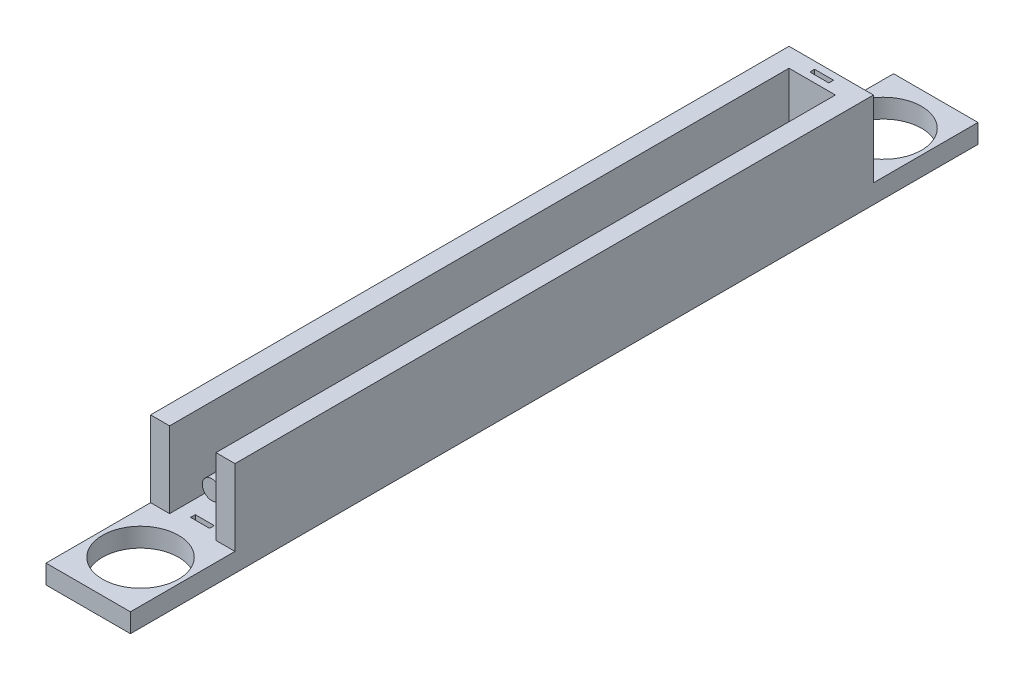
ISO-10303-21;
HEADER;
FILE_DESCRIPTION(('STEP AP214'),'2;1');
FILE_NAME('part.step','',(''),(''),'','','');
FILE_SCHEMA(('AUTOMOTIVE_DESIGN { 1 0 10303 214 1 1 1 1 }'));
ENDSEC;
DATA;
#1=APPLICATION_CONTEXT('core data for automotive mechanical design processes');
#2=APPLICATION_PROTOCOL_DEFINITION('international standard','automotive_design',2000,#1);
#3=PRODUCT_CONTEXT('',#1,'mechanical');
#4=PRODUCT('Part','Part','',(#3));
#5=PRODUCT_RELATED_PRODUCT_CATEGORY('part','',(#4));
#6=PRODUCT_DEFINITION_FORMATION('','',#4);
#7=PRODUCT_DEFINITION_CONTEXT('part definition',#1,'design');
#8=PRODUCT_DEFINITION('design','',#6,#7);
#9=PRODUCT_DEFINITION_SHAPE('','',#8);
#10=(LENGTH_UNIT() NAMED_UNIT(*) SI_UNIT(.MILLI.,.METRE.));
#11=(NAMED_UNIT(*) PLANE_ANGLE_UNIT() SI_UNIT($,.RADIAN.));
#12=(NAMED_UNIT(*) SI_UNIT($,.STERADIAN.) SOLID_ANGLE_UNIT());
#13=UNCERTAINTY_MEASURE_WITH_UNIT(LENGTH_MEASURE(1.E-05),#10,'distance_accuracy_value','');
#14=(GEOMETRIC_REPRESENTATION_CONTEXT(3) GLOBAL_UNCERTAINTY_ASSIGNED_CONTEXT((#13)) GLOBAL_UNIT_ASSIGNED_CONTEXT((#10,
#11,#12)) REPRESENTATION_CONTEXT('',''));
#15=CARTESIAN_POINT('',(0.,0.,0.));
#16=DIRECTION('',(0.,0.,1.));
#17=DIRECTION('',(1.,0.,0.));
#18=AXIS2_PLACEMENT_3D('',#15,#16,#17);
#19=CARTESIAN_POINT('',(-2.22,1.,-16.79));
#20=DIRECTION('',(0.,0.,1.));
#21=DIRECTION('',(1.,0.,0.));
#22=AXIS2_PLACEMENT_3D('',#19,#20,#21);
#23=PLANE('',#22);
#24=DIRECTION('',(1.,0.,0.));
#25=VECTOR('',#24,1.);
#26=CARTESIAN_POINT('',(2.22,1.,-16.79));
#27=LINE('',#26,#25);
#28=CARTESIAN_POINT('',(-2.22,1.,-16.79));
#29=VERTEX_POINT('',#28);
#30=CARTESIAN_POINT('',(2.22,1.,-16.79));
#31=VERTEX_POINT('',#30);
#32=EDGE_CURVE('E50',#29,#31,#27,.T.);
#33=ORIENTED_EDGE('',*,*,#32,.F.);
#34=DIRECTION('',(0.,-1.,0.));
#35=VECTOR('',#34,1.);
#36=CARTESIAN_POINT('',(-2.22,1.,-16.79));
#37=LINE('',#36,#35);
#38=CARTESIAN_POINT('',(-2.22,5.,-16.79));
#39=VERTEX_POINT('',#38);
#40=EDGE_CURVE('E325',#39,#29,#37,.T.);
#41=ORIENTED_EDGE('',*,*,#40,.F.);
#42=DIRECTION('',(-1.,0.,0.));
#43=VECTOR('',#42,1.);
#44=CARTESIAN_POINT('',(-2.22,5.,-16.79));
#45=LINE('',#44,#43);
#46=CARTESIAN_POINT('',(2.22,5.,-16.79));
#47=VERTEX_POINT('',#46);
#48=EDGE_CURVE('E283',#47,#39,#45,.T.);
#49=ORIENTED_EDGE('',*,*,#48,.F.);
#50=DIRECTION('',(0.,-1.,0.));
#51=VECTOR('',#50,1.);
#52=CARTESIAN_POINT('',(2.22,1.,-16.79));
#53=LINE('',#52,#51);
#54=EDGE_CURVE('E327',#47,#31,#53,.T.);
#55=ORIENTED_EDGE('',*,*,#54,.T.);
#56=EDGE_LOOP('',(#33,#41,#49,#55));
#57=FACE_BOUND('',#56,.T.);
#58=ADVANCED_FACE('F32',(#57),#23,.F.);
#59=CARTESIAN_POINT('',(-2.22,1.,16.79));
#60=DIRECTION('',(0.,0.,-1.));
#61=DIRECTION('',(-1.,0.,0.));
#62=AXIS2_PLACEMENT_3D('',#59,#60,#61);
#63=PLANE('',#62);
#64=DIRECTION('',(-1.,0.,0.));
#65=VECTOR('',#64,1.);
#66=CARTESIAN_POINT('',(2.22,1.,16.79));
#67=LINE('',#66,#65);
#68=CARTESIAN_POINT('',(2.22,1.,16.79));
#69=VERTEX_POINT('',#68);
#70=CARTESIAN_POINT('',(1.22,1.,16.79));
#71=VERTEX_POINT('',#70);
#72=EDGE_CURVE('E43',#69,#71,#67,.T.);
#73=ORIENTED_EDGE('',*,*,#72,.F.);
#74=DIRECTION('',(0.,-1.,0.));
#75=VECTOR('',#74,1.);
#76=CARTESIAN_POINT('',(2.22,1.,16.79));
#77=LINE('',#76,#75);
#78=CARTESIAN_POINT('',(2.22,5.,16.79));
#79=VERTEX_POINT('',#78);
#80=EDGE_CURVE('E321',#79,#69,#77,.T.);
#81=ORIENTED_EDGE('',*,*,#80,.F.);
#82=DIRECTION('',(1.,0.,0.));
#83=VECTOR('',#82,1.);
#84=CARTESIAN_POINT('',(2.22,5.,16.79));
#85=LINE('',#84,#83);
#86=CARTESIAN_POINT('',(1.22,5.,16.79));
#87=VERTEX_POINT('',#86);
#88=EDGE_CURVE('E298',#87,#79,#85,.T.);
#89=ORIENTED_EDGE('',*,*,#88,.F.);
#90=DIRECTION('',(0.,-1.,0.));
#91=VECTOR('',#90,1.);
#92=CARTESIAN_POINT('',(1.22,5.,16.79));
#93=LINE('',#92,#91);
#94=EDGE_CURVE('E304',#87,#71,#93,.T.);
#95=ORIENTED_EDGE('',*,*,#94,.T.);
#96=EDGE_LOOP('',(#73,#81,#89,#95));
#97=FACE_BOUND('',#96,.T.);
#98=ADVANCED_FACE('F374',(#97),#63,.F.);
#99=CARTESIAN_POINT('',(-1.22,1.,16.79));
#100=VERTEX_POINT('',#99);
#101=CARTESIAN_POINT('',(-2.22,1.,16.79));
#102=VERTEX_POINT('',#101);
#103=EDGE_CURVE('E11',#100,#102,#67,.T.);
#104=ORIENTED_EDGE('',*,*,#103,.F.);
#105=DIRECTION('',(0.,-1.,0.));
#106=VECTOR('',#105,1.);
#107=CARTESIAN_POINT('',(-1.22,5.,16.79));
#108=LINE('',#107,#106);
#109=CARTESIAN_POINT('',(-1.22,5.,16.79));
#110=VERTEX_POINT('',#109);
#111=EDGE_CURVE('E184',#110,#100,#108,.T.);
#112=ORIENTED_EDGE('',*,*,#111,.F.);
#113=DIRECTION('',(1.,0.,0.));
#114=VECTOR('',#113,1.);
#115=CARTESIAN_POINT('',(-2.22,5.,16.79));
#116=LINE('',#115,#114);
#117=CARTESIAN_POINT('',(-2.22,5.,16.79));
#118=VERTEX_POINT('',#117);
#119=EDGE_CURVE('E290',#118,#110,#116,.T.);
#120=ORIENTED_EDGE('',*,*,#119,.F.);
#121=DIRECTION('',(0.,-1.,0.));
#122=VECTOR('',#121,1.);
#123=CARTESIAN_POINT('',(-2.22,1.,16.79));
#124=LINE('',#123,#122);
#125=EDGE_CURVE('E323',#118,#102,#124,.T.);
#126=ORIENTED_EDGE('',*,*,#125,.T.);
#127=EDGE_LOOP('',(#104,#112,#120,#126));
#128=FACE_BOUND('',#127,.T.);
#129=ADVANCED_FACE('F378',(#128),#63,.F.);
#130=CARTESIAN_POINT('',(0.,1.,0.));
#131=DIRECTION('',(0.,-1.,0.));
#132=DIRECTION('',(0.,0.,-1.));
#133=AXIS2_PLACEMENT_3D('',#130,#131,#132);
#134=PLANE('',#133);
#135=CARTESIAN_POINT('',(0.,1.,19.5391712456763));
#136=DIRECTION('',(0.,1.,0.));
#137=DIRECTION('',(0.,0.,1.));
#138=AXIS2_PLACEMENT_3D('',#135,#136,#137);
#139=CIRCLE('',#138,2.);
#140=CARTESIAN_POINT('',(0.,1.,21.5391712456763));
#141=VERTEX_POINT('',#140);
#142=EDGE_CURVE('E210',#141,#141,#139,.T.);
#143=ORIENTED_EDGE('',*,*,#142,.F.);
#144=EDGE_LOOP('',(#143));
#145=FACE_BOUND('',#144,.T.);
#146=DIRECTION('',(-1.,0.,0.));
#147=VECTOR('',#146,1.);
#148=CARTESIAN_POINT('',(-0.500000000000003,1.,16.1585290962801));
#149=LINE('',#148,#147);
#150=CARTESIAN_POINT('',(0.499999999999998,1.,16.1585290962801));
#151=VERTEX_POINT('',#150);
#152=CARTESIAN_POINT('',(-0.500000000000003,1.,16.1585290962801));
#153=VERTEX_POINT('',#152);
#154=EDGE_CURVE('E261',#151,#153,#149,.T.);
#155=ORIENTED_EDGE('',*,*,#154,.F.);
#156=DIRECTION('',(0.,0.,-1.));
#157=VECTOR('',#156,1.);
#158=CARTESIAN_POINT('',(0.499999999999998,1.,16.1585290962801));
#159=LINE('',#158,#157);
#160=CARTESIAN_POINT('',(0.499999999999998,1.,16.4085290962801));
#161=VERTEX_POINT('',#160);
#162=EDGE_CURVE('E253',#161,#151,#159,.T.);
#163=ORIENTED_EDGE('',*,*,#162,.F.);
#164=DIRECTION('',(1.,0.,0.));
#165=VECTOR('',#164,1.);
#166=CARTESIAN_POINT('',(-0.500000000000003,1.,16.4085290962801));
#167=LINE('',#166,#165);
#168=CARTESIAN_POINT('',(-0.500000000000003,1.,16.4085290962801));
#169=VERTEX_POINT('',#168);
#170=EDGE_CURVE('E267',#169,#161,#167,.T.);
#171=ORIENTED_EDGE('',*,*,#170,.F.);
#172=DIRECTION('',(0.,0.,1.));
#173=VECTOR('',#172,1.);
#174=CARTESIAN_POINT('',(-0.500000000000003,1.,16.1585290962801));
#175=LINE('',#174,#173);
#176=EDGE_CURVE('E264',#153,#169,#175,.T.);
#177=ORIENTED_EDGE('',*,*,#176,.F.);
#178=EDGE_LOOP('',(#155,#163,#171,#177));
#179=FACE_BOUND('',#178,.T.);
#180=DIRECTION('',(0.,0.,1.));
#181=VECTOR('',#180,1.);
#182=CARTESIAN_POINT('',(1.22,1.,16.79));
#183=LINE('',#182,#181);
#184=CARTESIAN_POINT('',(1.22,1.,-15.79));
#185=VERTEX_POINT('',#184);
#186=EDGE_CURVE('E287',#185,#71,#183,.T.);
#187=ORIENTED_EDGE('',*,*,#186,.F.);
#188=DIRECTION('',(1.,0.,0.));
#189=VECTOR('',#188,1.);
#190=CARTESIAN_POINT('',(-1.22,1.,-15.79));
#191=LINE('',#190,#189);
#192=CARTESIAN_POINT('',(-1.22,1.,-15.79));
#193=VERTEX_POINT('',#192);
#194=EDGE_CURVE('E307',#193,#185,#191,.T.);
#195=ORIENTED_EDGE('',*,*,#194,.F.);
#196=DIRECTION('',(0.,0.,-1.));
#197=VECTOR('',#196,1.);
#198=CARTESIAN_POINT('',(-1.22,1.,-15.79));
#199=LINE('',#198,#197);
#200=EDGE_CURVE('E282',#100,#193,#199,.T.);
#201=ORIENTED_EDGE('',*,*,#200,.F.);
#202=ORIENTED_EDGE('',*,*,#103,.T.);
#203=DIRECTION('',(0.,0.,-1.));
#204=VECTOR('',#203,1.);
#205=CARTESIAN_POINT('',(-2.22,1.,22.29));
#206=LINE('',#205,#204);
#207=CARTESIAN_POINT('',(-2.22,1.,22.29));
#208=VERTEX_POINT('',#207);
#209=EDGE_CURVE('E220',#208,#102,#206,.T.);
#210=ORIENTED_EDGE('',*,*,#209,.F.);
#211=DIRECTION('',(-1.,0.,0.));
#212=VECTOR('',#211,1.);
#213=CARTESIAN_POINT('',(2.22,1.,22.29));
#214=LINE('',#213,#212);
#215=CARTESIAN_POINT('',(2.22,1.,22.29));
#216=VERTEX_POINT('',#215);
#217=EDGE_CURVE('E214',#216,#208,#214,.T.);
#218=ORIENTED_EDGE('',*,*,#217,.F.);
#219=DIRECTION('',(0.,0.,-1.));
#220=VECTOR('',#219,1.);
#221=CARTESIAN_POINT('',(2.22,1.,22.29));
#222=LINE('',#221,#220);
#223=EDGE_CURVE('E224',#216,#69,#222,.T.);
#224=ORIENTED_EDGE('',*,*,#223,.T.);
#225=ORIENTED_EDGE('',*,*,#72,.T.);
#226=EDGE_LOOP('',(#187,#195,#201,#202,#210,#218,#224,#225));
#227=FACE_BOUND('',#226,.T.);
#228=ADVANCED_FACE('F357',(#145,#179,#227),#134,.F.);
#229=CARTESIAN_POINT('',(2.22,1.,16.79));
#230=DIRECTION('',(-1.,0.,0.));
#231=DIRECTION('',(0.,0.,1.));
#232=AXIS2_PLACEMENT_3D('',#229,#230,#231);
#233=PLANE('',#232);
#234=DIRECTION('',(0.,0.,-1.));
#235=VECTOR('',#234,1.);
#236=CARTESIAN_POINT('',(2.22,0.,16.79));
#237=LINE('',#236,#235);
#238=CARTESIAN_POINT('',(2.22,0.,22.29));
#239=VERTEX_POINT('',#238);
#240=CARTESIAN_POINT('',(2.22,0.,-22.29));
#241=VERTEX_POINT('',#240);
#242=EDGE_CURVE('E172',#239,#241,#237,.T.);
#243=ORIENTED_EDGE('',*,*,#242,.T.);
#244=DIRECTION('',(0.,-1.,0.));
#245=VECTOR('',#244,1.);
#246=CARTESIAN_POINT('',(2.22,0.,-22.29));
#247=LINE('',#246,#245);
#248=CARTESIAN_POINT('',(2.22,1.,-22.29));
#249=VERTEX_POINT('',#248);
#250=EDGE_CURVE('E176',#249,#241,#247,.T.);
#251=ORIENTED_EDGE('',*,*,#250,.F.);
#252=DIRECTION('',(0.,0.,1.));
#253=VECTOR('',#252,1.);
#254=CARTESIAN_POINT('',(2.22,1.,-22.29));
#255=LINE('',#254,#253);
#256=EDGE_CURVE('E204',#249,#31,#255,.T.);
#257=ORIENTED_EDGE('',*,*,#256,.T.);
#258=ORIENTED_EDGE('',*,*,#54,.F.);
#259=DIRECTION('',(0.,0.,-1.));
#260=VECTOR('',#259,1.);
#261=CARTESIAN_POINT('',(2.22,5.,16.79));
#262=LINE('',#261,#260);
#263=EDGE_CURVE('E301',#79,#47,#262,.T.);
#264=ORIENTED_EDGE('',*,*,#263,.F.);
#265=ORIENTED_EDGE('',*,*,#80,.T.);
#266=ORIENTED_EDGE('',*,*,#223,.F.);
#267=DIRECTION('',(0.,1.,0.));
#268=VECTOR('',#267,1.);
#269=CARTESIAN_POINT('',(2.22,0.,22.29));
#270=LINE('',#269,#268);
#271=EDGE_CURVE('E179',#239,#216,#270,.T.);
#272=ORIENTED_EDGE('',*,*,#271,.F.);
#273=EDGE_LOOP('',(#243,#251,#257,#258,#264,#265,#266,#272));
#274=FACE_BOUND('',#273,.T.);
#275=ADVANCED_FACE('F34',(#274),#233,.F.);
#276=CARTESIAN_POINT('',(-2.22,1.,16.79));
#277=DIRECTION('',(1.,0.,0.));
#278=DIRECTION('',(0.,0.,-1.));
#279=AXIS2_PLACEMENT_3D('',#276,#277,#278);
#280=PLANE('',#279);
#281=DIRECTION('',(0.,0.,1.));
#282=VECTOR('',#281,1.);
#283=CARTESIAN_POINT('',(-2.22,0.,16.79));
#284=LINE('',#283,#282);
#285=CARTESIAN_POINT('',(-2.22,0.,-22.29));
#286=VERTEX_POINT('',#285);
#287=CARTESIAN_POINT('',(-2.22,0.,22.29));
#288=VERTEX_POINT('',#287);
#289=EDGE_CURVE('E183',#286,#288,#284,.T.);
#290=ORIENTED_EDGE('',*,*,#289,.T.);
#291=DIRECTION('',(0.,-1.,0.));
#292=VECTOR('',#291,1.);
#293=CARTESIAN_POINT('',(-2.22,0.,22.29));
#294=LINE('',#293,#292);
#295=EDGE_CURVE('E216',#208,#288,#294,.T.);
#296=ORIENTED_EDGE('',*,*,#295,.F.);
#297=ORIENTED_EDGE('',*,*,#209,.T.);
#298=ORIENTED_EDGE('',*,*,#125,.F.);
#299=DIRECTION('',(0.,0.,1.));
#300=VECTOR('',#299,1.);
#301=CARTESIAN_POINT('',(-2.22,5.,-16.79));
#302=LINE('',#301,#300);
#303=EDGE_CURVE('E286',#39,#118,#302,.T.);
#304=ORIENTED_EDGE('',*,*,#303,.F.);
#305=ORIENTED_EDGE('',*,*,#40,.T.);
#306=DIRECTION('',(0.,0.,1.));
#307=VECTOR('',#306,1.);
#308=CARTESIAN_POINT('',(-2.22,1.,-22.29));
#309=LINE('',#308,#307);
#310=CARTESIAN_POINT('',(-2.22,1.,-22.29));
#311=VERTEX_POINT('',#310);
#312=EDGE_CURVE('E207',#311,#29,#309,.T.);
#313=ORIENTED_EDGE('',*,*,#312,.F.);
#314=DIRECTION('',(0.,1.,0.));
#315=VECTOR('',#314,1.);
#316=CARTESIAN_POINT('',(-2.22,0.,-22.29));
#317=LINE('',#316,#315);
#318=EDGE_CURVE('E191',#286,#311,#317,.T.);
#319=ORIENTED_EDGE('',*,*,#318,.F.);
#320=EDGE_LOOP('',(#290,#296,#297,#298,#304,#305,#313,#319));
#321=FACE_BOUND('',#320,.T.);
#322=ADVANCED_FACE('F381',(#321),#280,.F.);
#323=CARTESIAN_POINT('',(0.,0.,0.));
#324=DIRECTION('',(0.,-1.,0.));
#325=DIRECTION('',(0.,0.,-1.));
#326=AXIS2_PLACEMENT_3D('',#323,#324,#325);
#327=PLANE('',#326);
#328=CARTESIAN_POINT('',(0.,0.,-19.54));
#329=DIRECTION('',(0.,-1.,0.));
#330=DIRECTION('',(0.,0.,-1.));
#331=AXIS2_PLACEMENT_3D('',#328,#329,#330);
#332=CIRCLE('',#331,2.);
#333=CARTESIAN_POINT('',(0.,0.,-21.54));
#334=VERTEX_POINT('',#333);
#335=EDGE_CURVE('E198',#334,#334,#332,.T.);
#336=ORIENTED_EDGE('',*,*,#335,.F.);
#337=EDGE_LOOP('',(#336));
#338=FACE_BOUND('',#337,.T.);
#339=CARTESIAN_POINT('',(0.,0.,19.5391712456763));
#340=DIRECTION('',(0.,-1.,0.));
#341=DIRECTION('',(0.,0.,-1.));
#342=AXIS2_PLACEMENT_3D('',#339,#340,#341);
#343=CIRCLE('',#342,2.);
#344=CARTESIAN_POINT('',(0.,0.,17.5391712456763));
#345=VERTEX_POINT('',#344);
#346=EDGE_CURVE('E36',#345,#345,#343,.T.);
#347=ORIENTED_EDGE('',*,*,#346,.F.);
#348=EDGE_LOOP('',(#347));
#349=FACE_BOUND('',#348,.T.);
#350=DIRECTION('',(0.,0.,1.));
#351=VECTOR('',#350,1.);
#352=CARTESIAN_POINT('',(0.499999999999998,0.,0.));
#353=LINE('',#352,#351);
#354=CARTESIAN_POINT('',(0.499999999999998,0.,16.1585290962801));
#355=VERTEX_POINT('',#354);
#356=CARTESIAN_POINT('',(0.499999999999998,0.,16.4085290962801));
#357=VERTEX_POINT('',#356);
#358=EDGE_CURVE('E41',#355,#357,#353,.T.);
#359=ORIENTED_EDGE('',*,*,#358,.F.);
#360=DIRECTION('',(1.,0.,0.));
#361=VECTOR('',#360,1.);
#362=CARTESIAN_POINT('',(0.,0.,16.1585290962801));
#363=LINE('',#362,#361);
#364=CARTESIAN_POINT('',(-0.500000000000003,0.,16.1585290962801));
#365=VERTEX_POINT('',#364);
#366=EDGE_CURVE('E332',#365,#355,#363,.T.);
#367=ORIENTED_EDGE('',*,*,#366,.F.);
#368=DIRECTION('',(0.,0.,-1.));
#369=VECTOR('',#368,1.);
#370=CARTESIAN_POINT('',(-0.50000000000001,0.,0.));
#371=LINE('',#370,#369);
#372=CARTESIAN_POINT('',(-0.500000000000003,0.,16.4085290962801));
#373=VERTEX_POINT('',#372);
#374=EDGE_CURVE('E334',#373,#365,#371,.T.);
#375=ORIENTED_EDGE('',*,*,#374,.F.);
#376=DIRECTION('',(-1.,0.,0.));
#377=VECTOR('',#376,1.);
#378=CARTESIAN_POINT('',(0.,0.,16.4085290962801));
#379=LINE('',#378,#377);
#380=EDGE_CURVE('E337',#357,#373,#379,.T.);
#381=ORIENTED_EDGE('',*,*,#380,.F.);
#382=EDGE_LOOP('',(#359,#367,#375,#381));
#383=FACE_BOUND('',#382,.T.);
#384=ORIENTED_EDGE('',*,*,#242,.F.);
#385=DIRECTION('',(1.,0.,0.));
#386=VECTOR('',#385,1.);
#387=CARTESIAN_POINT('',(2.22,0.,22.29));
#388=LINE('',#387,#386);
#389=EDGE_CURVE('E219',#288,#239,#388,.T.);
#390=ORIENTED_EDGE('',*,*,#389,.F.);
#391=ORIENTED_EDGE('',*,*,#289,.F.);
#392=DIRECTION('',(-1.,0.,0.));
#393=VECTOR('',#392,1.);
#394=CARTESIAN_POINT('',(2.22,0.,-22.29));
#395=LINE('',#394,#393);
#396=EDGE_CURVE('E187',#241,#286,#395,.T.);
#397=ORIENTED_EDGE('',*,*,#396,.F.);
#398=EDGE_LOOP('',(#384,#390,#391,#397));
#399=FACE_BOUND('',#398,.T.);
#400=ADVANCED_FACE('F188',(#338,#349,#383,#399),#327,.T.);
#401=CARTESIAN_POINT('',(-1.22,5.,-15.79));
#402=DIRECTION('',(-1.,0.,0.));
#403=DIRECTION('',(0.,0.,1.));
#404=AXIS2_PLACEMENT_3D('',#401,#402,#403);
#405=PLANE('',#404);
#406=ORIENTED_EDGE('',*,*,#200,.T.);
#407=DIRECTION('',(0.,-1.,0.));
#408=VECTOR('',#407,1.);
#409=CARTESIAN_POINT('',(-1.22,5.,-15.79));
#410=LINE('',#409,#408);
#411=CARTESIAN_POINT('',(-1.22,5.,-15.79));
#412=VERTEX_POINT('',#411);
#413=EDGE_CURVE('E315',#412,#193,#410,.T.);
#414=ORIENTED_EDGE('',*,*,#413,.F.);
#415=DIRECTION('',(0.,0.,-1.));
#416=VECTOR('',#415,1.);
#417=CARTESIAN_POINT('',(-1.22,5.,-15.79));
#418=LINE('',#417,#416);
#419=EDGE_CURVE('E292',#110,#412,#418,.T.);
#420=ORIENTED_EDGE('',*,*,#419,.F.);
#421=ORIENTED_EDGE('',*,*,#111,.T.);
#422=EDGE_LOOP('',(#406,#414,#420,#421));
#423=FACE_BOUND('',#422,.T.);
#424=ADVANCED_FACE('F387',(#423),#405,.F.);
#425=CARTESIAN_POINT('',(-1.22,5.,-15.79));
#426=DIRECTION('',(0.,0.,-1.));
#427=DIRECTION('',(-1.,0.,0.));
#428=AXIS2_PLACEMENT_3D('',#425,#426,#427);
#429=PLANE('',#428);
#430=CARTESIAN_POINT('',(0.,2.2,-15.79));
#431=DIRECTION('',(0.,0.,-1.));
#432=DIRECTION('',(-1.,0.,0.));
#433=AXIS2_PLACEMENT_3D('',#430,#431,#432);
#434=CIRCLE('',#433,0.5);
#435=CARTESIAN_POINT('',(-0.5,2.2,-15.79));
#436=VERTEX_POINT('',#435);
#437=EDGE_CURVE('E329',#436,#436,#434,.F.);
#438=ORIENTED_EDGE('',*,*,#437,.F.);
#439=EDGE_LOOP('',(#438));
#440=FACE_BOUND('',#439,.T.);
#441=ORIENTED_EDGE('',*,*,#194,.T.);
#442=DIRECTION('',(0.,-1.,0.));
#443=VECTOR('',#442,1.);
#444=CARTESIAN_POINT('',(1.22,5.,-15.79));
#445=LINE('',#444,#443);
#446=CARTESIAN_POINT('',(1.22,5.,-15.79));
#447=VERTEX_POINT('',#446);
#448=EDGE_CURVE('E312',#447,#185,#445,.T.);
#449=ORIENTED_EDGE('',*,*,#448,.F.);
#450=DIRECTION('',(1.,0.,0.));
#451=VECTOR('',#450,1.);
#452=CARTESIAN_POINT('',(-1.22,5.,-15.79));
#453=LINE('',#452,#451);
#454=EDGE_CURVE('E294',#412,#447,#453,.T.);
#455=ORIENTED_EDGE('',*,*,#454,.F.);
#456=ORIENTED_EDGE('',*,*,#413,.T.);
#457=EDGE_LOOP('',(#441,#449,#455,#456));
#458=FACE_BOUND('',#457,.T.);
#459=ADVANCED_FACE('F394',(#440,#458),#429,.F.);
#460=CARTESIAN_POINT('',(1.22,5.,16.79));
#461=DIRECTION('',(1.,0.,0.));
#462=DIRECTION('',(0.,0.,-1.));
#463=AXIS2_PLACEMENT_3D('',#460,#461,#462);
#464=PLANE('',#463);
#465=ORIENTED_EDGE('',*,*,#186,.T.);
#466=ORIENTED_EDGE('',*,*,#94,.F.);
#467=DIRECTION('',(0.,0.,1.));
#468=VECTOR('',#467,1.);
#469=CARTESIAN_POINT('',(1.22,5.,16.79));
#470=LINE('',#469,#468);
#471=EDGE_CURVE('E296',#447,#87,#470,.T.);
#472=ORIENTED_EDGE('',*,*,#471,.F.);
#473=ORIENTED_EDGE('',*,*,#448,.T.);
#474=EDGE_LOOP('',(#465,#466,#472,#473));
#475=FACE_BOUND('',#474,.T.);
#476=ADVANCED_FACE('F398',(#475),#464,.F.);
#477=CARTESIAN_POINT('',(0.,5.,0.));
#478=DIRECTION('',(0.,1.,0.));
#479=DIRECTION('',(0.,0.,1.));
#480=AXIS2_PLACEMENT_3D('',#477,#478,#479);
#481=PLANE('',#480);
#482=DIRECTION('',(0.,0.,-1.));
#483=VECTOR('',#482,1.);
#484=CARTESIAN_POINT('',(0.499999999999992,5.,-16.415));
#485=LINE('',#484,#483);
#486=CARTESIAN_POINT('',(0.499999999999992,5.,-16.165));
#487=VERTEX_POINT('',#486);
#488=CARTESIAN_POINT('',(0.499999999999992,5.,-16.415));
#489=VERTEX_POINT('',#488);
#490=EDGE_CURVE('E227',#487,#489,#485,.T.);
#491=ORIENTED_EDGE('',*,*,#490,.F.);
#492=DIRECTION('',(1.,0.,0.));
#493=VECTOR('',#492,1.);
#494=CARTESIAN_POINT('',(-0.500000000000008,5.,-16.165));
#495=LINE('',#494,#493);
#496=CARTESIAN_POINT('',(-0.500000000000008,5.,-16.165));
#497=VERTEX_POINT('',#496);
#498=EDGE_CURVE('E232',#497,#487,#495,.T.);
#499=ORIENTED_EDGE('',*,*,#498,.F.);
#500=DIRECTION('',(0.,0.,1.));
#501=VECTOR('',#500,1.);
#502=CARTESIAN_POINT('',(-0.500000000000008,5.,-16.415));
#503=LINE('',#502,#501);
#504=CARTESIAN_POINT('',(-0.500000000000008,5.,-16.415));
#505=VERTEX_POINT('',#504);
#506=EDGE_CURVE('E246',#505,#497,#503,.T.);
#507=ORIENTED_EDGE('',*,*,#506,.F.);
#508=DIRECTION('',(-1.,0.,0.));
#509=VECTOR('',#508,1.);
#510=CARTESIAN_POINT('',(-0.500000000000008,5.,-16.415));
#511=LINE('',#510,#509);
#512=EDGE_CURVE('E243',#489,#505,#511,.T.);
#513=ORIENTED_EDGE('',*,*,#512,.F.);
#514=EDGE_LOOP('',(#491,#499,#507,#513));
#515=FACE_BOUND('',#514,.T.);
#516=ORIENTED_EDGE('',*,*,#48,.T.);
#517=ORIENTED_EDGE('',*,*,#303,.T.);
#518=ORIENTED_EDGE('',*,*,#119,.T.);
#519=ORIENTED_EDGE('',*,*,#419,.T.);
#520=ORIENTED_EDGE('',*,*,#454,.T.);
#521=ORIENTED_EDGE('',*,*,#471,.T.);
#522=ORIENTED_EDGE('',*,*,#88,.T.);
#523=ORIENTED_EDGE('',*,*,#263,.T.);
#524=EDGE_LOOP('',(#516,#517,#518,#519,#520,#521,#522,#523));
#525=FACE_BOUND('',#524,.T.);
#526=ADVANCED_FACE('F402',(#515,#525),#481,.T.);
#527=CARTESIAN_POINT('',(0.,2.2,15.79));
#528=DIRECTION('',(0.,0.,-1.));
#529=DIRECTION('',(-1.,0.,0.));
#530=AXIS2_PLACEMENT_3D('',#527,#528,#529);
#531=CYLINDRICAL_SURFACE('',#530,0.5);
#532=CARTESIAN_POINT('',(0.,2.2,15.79));
#533=DIRECTION('',(0.,0.,1.));
#534=DIRECTION('',(1.,0.,0.));
#535=AXIS2_PLACEMENT_3D('',#532,#533,#534);
#536=CIRCLE('',#535,0.5);
#537=CARTESIAN_POINT('',(0.5,2.2,15.79));
#538=VERTEX_POINT('',#537);
#539=EDGE_CURVE('E273',#538,#538,#536,.T.);
#540=ORIENTED_EDGE('',*,*,#539,.F.);
#541=EDGE_LOOP('',(#540));
#542=FACE_BOUND('',#541,.T.);
#543=ORIENTED_EDGE('',*,*,#437,.T.);
#544=EDGE_LOOP('',(#543));
#545=FACE_BOUND('',#544,.T.);
#546=ADVANCED_FACE('F406',(#542,#545),#531,.T.);
#547=CARTESIAN_POINT('',(0.,2.2,15.79));
#548=DIRECTION('',(0.,0.,1.));
#549=DIRECTION('',(1.,0.,0.));
#550=AXIS2_PLACEMENT_3D('',#547,#548,#549);
#551=PLANE('',#550);
#552=ORIENTED_EDGE('',*,*,#539,.T.);
#553=EDGE_LOOP('',(#552));
#554=FACE_BOUND('',#553,.T.);
#555=ADVANCED_FACE('F410',(#554),#551,.T.);
#556=CARTESIAN_POINT('',(0.499999999999998,-30.58,16.1585290962801));
#557=DIRECTION('',(1.,0.,0.));
#558=DIRECTION('',(0.,0.,-1.));
#559=AXIS2_PLACEMENT_3D('',#556,#557,#558);
#560=PLANE('',#559);
#561=ORIENTED_EDGE('',*,*,#358,.T.);
#562=DIRECTION('',(0.,1.,0.));
#563=VECTOR('',#562,1.);
#564=CARTESIAN_POINT('',(0.499999999999998,-30.58,16.4085290962801));
#565=LINE('',#564,#563);
#566=EDGE_CURVE('E271',#357,#161,#565,.T.);
#567=ORIENTED_EDGE('',*,*,#566,.T.);
#568=ORIENTED_EDGE('',*,*,#162,.T.);
#569=DIRECTION('',(0.,1.,0.));
#570=VECTOR('',#569,1.);
#571=CARTESIAN_POINT('',(0.499999999999998,-30.58,16.1585290962801));
#572=LINE('',#571,#570);
#573=EDGE_CURVE('E270',#355,#151,#572,.T.);
#574=ORIENTED_EDGE('',*,*,#573,.F.);
#575=EDGE_LOOP('',(#561,#567,#568,#574));
#576=FACE_BOUND('',#575,.T.);
#577=ADVANCED_FACE('F342',(#576),#560,.F.);
#578=CARTESIAN_POINT('',(-0.500000000000003,-30.58,16.4085290962801));
#579=DIRECTION('',(0.,0.,1.));
#580=DIRECTION('',(1.,0.,0.));
#581=AXIS2_PLACEMENT_3D('',#578,#579,#580);
#582=PLANE('',#581);
#583=ORIENTED_EDGE('',*,*,#380,.T.);
#584=DIRECTION('',(0.,1.,0.));
#585=VECTOR('',#584,1.);
#586=CARTESIAN_POINT('',(-0.500000000000003,-30.58,16.4085290962801));
#587=LINE('',#586,#585);
#588=EDGE_CURVE('E274',#373,#169,#587,.T.);
#589=ORIENTED_EDGE('',*,*,#588,.T.);
#590=ORIENTED_EDGE('',*,*,#170,.T.);
#591=ORIENTED_EDGE('',*,*,#566,.F.);
#592=EDGE_LOOP('',(#583,#589,#590,#591));
#593=FACE_BOUND('',#592,.T.);
#594=ADVANCED_FACE('F347',(#593),#582,.F.);
#595=CARTESIAN_POINT('',(-0.500000000000003,-30.58,16.1585290962801));
#596=DIRECTION('',(-1.,0.,0.));
#597=DIRECTION('',(0.,0.,1.));
#598=AXIS2_PLACEMENT_3D('',#595,#596,#597);
#599=PLANE('',#598);
#600=ORIENTED_EDGE('',*,*,#374,.T.);
#601=DIRECTION('',(0.,1.,0.));
#602=VECTOR('',#601,1.);
#603=CARTESIAN_POINT('',(-0.500000000000003,-30.58,16.1585290962801));
#604=LINE('',#603,#602);
#605=EDGE_CURVE('E276',#365,#153,#604,.T.);
#606=ORIENTED_EDGE('',*,*,#605,.T.);
#607=ORIENTED_EDGE('',*,*,#176,.T.);
#608=ORIENTED_EDGE('',*,*,#588,.F.);
#609=EDGE_LOOP('',(#600,#606,#607,#608));
#610=FACE_BOUND('',#609,.T.);
#611=ADVANCED_FACE('F353',(#610),#599,.F.);
#612=CARTESIAN_POINT('',(-0.500000000000003,-30.58,16.1585290962801));
#613=DIRECTION('',(0.,0.,-1.));
#614=DIRECTION('',(-1.,0.,0.));
#615=AXIS2_PLACEMENT_3D('',#612,#613,#614);
#616=PLANE('',#615);
#617=ORIENTED_EDGE('',*,*,#366,.T.);
#618=ORIENTED_EDGE('',*,*,#573,.T.);
#619=ORIENTED_EDGE('',*,*,#154,.T.);
#620=ORIENTED_EDGE('',*,*,#605,.F.);
#621=EDGE_LOOP('',(#617,#618,#619,#620));
#622=FACE_BOUND('',#621,.T.);
#623=ADVANCED_FACE('F360',(#622),#616,.F.);
#624=CARTESIAN_POINT('',(0.499999999999992,4.,-16.415));
#625=DIRECTION('',(1.,0.,0.));
#626=DIRECTION('',(0.,0.,-1.));
#627=AXIS2_PLACEMENT_3D('',#624,#625,#626);
#628=PLANE('',#627);
#629=ORIENTED_EDGE('',*,*,#490,.T.);
#630=DIRECTION('',(0.,1.,0.));
#631=VECTOR('',#630,1.);
#632=CARTESIAN_POINT('',(0.499999999999992,4.,-16.415));
#633=LINE('',#632,#631);
#634=CARTESIAN_POINT('',(0.499999999999992,4.,-16.415));
#635=VERTEX_POINT('',#634);
#636=EDGE_CURVE('E241',#635,#489,#633,.T.);
#637=ORIENTED_EDGE('',*,*,#636,.F.);
#638=DIRECTION('',(0.,0.,-1.));
#639=VECTOR('',#638,1.);
#640=CARTESIAN_POINT('',(0.499999999999992,4.,-16.415));
#641=LINE('',#640,#639);
#642=CARTESIAN_POINT('',(0.499999999999992,4.,-16.165));
#643=VERTEX_POINT('',#642);
#644=EDGE_CURVE('E228',#643,#635,#641,.T.);
#645=ORIENTED_EDGE('',*,*,#644,.F.);
#646=DIRECTION('',(0.,1.,0.));
#647=VECTOR('',#646,1.);
#648=CARTESIAN_POINT('',(0.499999999999992,4.,-16.165));
#649=LINE('',#648,#647);
#650=EDGE_CURVE('E251',#643,#487,#649,.T.);
#651=ORIENTED_EDGE('',*,*,#650,.T.);
#652=EDGE_LOOP('',(#629,#637,#645,#651));
#653=FACE_BOUND('',#652,.T.);
#654=ADVANCED_FACE('F362',(#653),#628,.F.);
#655=CARTESIAN_POINT('',(-0.500000000000008,4.,-16.165));
#656=DIRECTION('',(0.,0.,1.));
#657=DIRECTION('',(1.,0.,0.));
#658=AXIS2_PLACEMENT_3D('',#655,#656,#657);
#659=PLANE('',#658);
#660=ORIENTED_EDGE('',*,*,#498,.T.);
#661=ORIENTED_EDGE('',*,*,#650,.F.);
#662=DIRECTION('',(1.,0.,0.));
#663=VECTOR('',#662,1.);
#664=CARTESIAN_POINT('',(-0.500000000000008,4.,-16.165));
#665=LINE('',#664,#663);
#666=CARTESIAN_POINT('',(-0.500000000000008,4.,-16.165));
#667=VERTEX_POINT('',#666);
#668=EDGE_CURVE('E238',#667,#643,#665,.T.);
#669=ORIENTED_EDGE('',*,*,#668,.F.);
#670=DIRECTION('',(0.,1.,0.));
#671=VECTOR('',#670,1.);
#672=CARTESIAN_POINT('',(-0.500000000000008,4.,-16.165));
#673=LINE('',#672,#671);
#674=EDGE_CURVE('E254',#667,#497,#673,.T.);
#675=ORIENTED_EDGE('',*,*,#674,.T.);
#676=EDGE_LOOP('',(#660,#661,#669,#675));
#677=FACE_BOUND('',#676,.T.);
#678=ADVANCED_FACE('F368',(#677),#659,.F.);
#679=CARTESIAN_POINT('',(-0.500000000000008,4.,-16.415));
#680=DIRECTION('',(-1.,0.,0.));
#681=DIRECTION('',(0.,0.,1.));
#682=AXIS2_PLACEMENT_3D('',#679,#680,#681);
#683=PLANE('',#682);
#684=ORIENTED_EDGE('',*,*,#506,.T.);
#685=ORIENTED_EDGE('',*,*,#674,.F.);
#686=DIRECTION('',(0.,0.,1.));
#687=VECTOR('',#686,1.);
#688=CARTESIAN_POINT('',(-0.500000000000008,4.,-16.415));
#689=LINE('',#688,#687);
#690=CARTESIAN_POINT('',(-0.500000000000008,4.,-16.415));
#691=VERTEX_POINT('',#690);
#692=EDGE_CURVE('E235',#691,#667,#689,.T.);
#693=ORIENTED_EDGE('',*,*,#692,.F.);
#694=DIRECTION('',(0.,1.,0.));
#695=VECTOR('',#694,1.);
#696=CARTESIAN_POINT('',(-0.500000000000008,4.,-16.415));
#697=LINE('',#696,#695);
#698=EDGE_CURVE('E256',#691,#505,#697,.T.);
#699=ORIENTED_EDGE('',*,*,#698,.T.);
#700=EDGE_LOOP('',(#684,#685,#693,#699));
#701=FACE_BOUND('',#700,.T.);
#702=ADVANCED_FACE('F426',(#701),#683,.F.);
#703=CARTESIAN_POINT('',(-0.500000000000008,4.,-16.415));
#704=DIRECTION('',(0.,0.,-1.));
#705=DIRECTION('',(-1.,0.,0.));
#706=AXIS2_PLACEMENT_3D('',#703,#704,#705);
#707=PLANE('',#706);
#708=ORIENTED_EDGE('',*,*,#512,.T.);
#709=ORIENTED_EDGE('',*,*,#698,.F.);
#710=DIRECTION('',(-1.,0.,0.));
#711=VECTOR('',#710,1.);
#712=CARTESIAN_POINT('',(-0.500000000000008,4.,-16.415));
#713=LINE('',#712,#711);
#714=EDGE_CURVE('E231',#635,#691,#713,.T.);
#715=ORIENTED_EDGE('',*,*,#714,.F.);
#716=ORIENTED_EDGE('',*,*,#636,.T.);
#717=EDGE_LOOP('',(#708,#709,#715,#716));
#718=FACE_BOUND('',#717,.T.);
#719=ADVANCED_FACE('F422',(#718),#707,.F.);
#720=CARTESIAN_POINT('',(0.,4.,0.));
#721=DIRECTION('',(0.,1.,0.));
#722=DIRECTION('',(0.,0.,1.));
#723=AXIS2_PLACEMENT_3D('',#720,#721,#722);
#724=PLANE('',#723);
#725=ORIENTED_EDGE('',*,*,#644,.T.);
#726=ORIENTED_EDGE('',*,*,#714,.T.);
#727=ORIENTED_EDGE('',*,*,#692,.T.);
#728=ORIENTED_EDGE('',*,*,#668,.T.);
#729=EDGE_LOOP('',(#725,#726,#727,#728));
#730=FACE_BOUND('',#729,.T.);
#731=ADVANCED_FACE('F425',(#730),#724,.T.);
#732=CARTESIAN_POINT('',(0.,0.,22.29));
#733=DIRECTION('',(0.,0.,1.));
#734=DIRECTION('',(1.,0.,0.));
#735=AXIS2_PLACEMENT_3D('',#732,#733,#734);
#736=PLANE('',#735);
#737=ORIENTED_EDGE('',*,*,#271,.T.);
#738=ORIENTED_EDGE('',*,*,#217,.T.);
#739=ORIENTED_EDGE('',*,*,#295,.T.);
#740=ORIENTED_EDGE('',*,*,#389,.T.);
#741=EDGE_LOOP('',(#737,#738,#739,#740));
#742=FACE_BOUND('',#741,.T.);
#743=ADVANCED_FACE('F436',(#742),#736,.T.);
#744=CARTESIAN_POINT('',(0.,-4.5,19.5391712456763));
#745=DIRECTION('',(0.,1.,0.));
#746=DIRECTION('',(0.,0.,1.));
#747=AXIS2_PLACEMENT_3D('',#744,#745,#746);
#748=CYLINDRICAL_SURFACE('',#747,2.);
#749=ORIENTED_EDGE('',*,*,#346,.T.);
#750=EDGE_LOOP('',(#749));
#751=FACE_BOUND('',#750,.T.);
#752=ORIENTED_EDGE('',*,*,#142,.T.);
#753=EDGE_LOOP('',(#752));
#754=FACE_BOUND('',#753,.T.);
#755=ADVANCED_FACE('F440',(#751,#754),#748,.F.);
#756=CARTESIAN_POINT('',(2.22,1.,-22.29));
#757=DIRECTION('',(0.,-1.,0.));
#758=DIRECTION('',(0.,0.,-1.));
#759=AXIS2_PLACEMENT_3D('',#756,#757,#758);
#760=PLANE('',#759);
#761=CARTESIAN_POINT('',(0.,1.,-19.54));
#762=DIRECTION('',(0.,1.,0.));
#763=DIRECTION('',(0.,0.,1.));
#764=AXIS2_PLACEMENT_3D('',#761,#762,#763);
#765=CIRCLE('',#764,2.);
#766=CARTESIAN_POINT('',(0.,1.,-17.54));
#767=VERTEX_POINT('',#766);
#768=EDGE_CURVE('E461',#767,#767,#765,.T.);
#769=ORIENTED_EDGE('',*,*,#768,.F.);
#770=EDGE_LOOP('',(#769));
#771=FACE_BOUND('',#770,.T.);
#772=ORIENTED_EDGE('',*,*,#32,.T.);
#773=ORIENTED_EDGE('',*,*,#256,.F.);
#774=DIRECTION('',(1.,0.,0.));
#775=VECTOR('',#774,1.);
#776=CARTESIAN_POINT('',(2.22,1.,-22.29));
#777=LINE('',#776,#775);
#778=EDGE_CURVE('E195',#311,#249,#777,.T.);
#779=ORIENTED_EDGE('',*,*,#778,.F.);
#780=ORIENTED_EDGE('',*,*,#312,.T.);
#781=EDGE_LOOP('',(#772,#773,#779,#780));
#782=FACE_BOUND('',#781,.T.);
#783=ADVANCED_FACE('F444',(#771,#782),#760,.F.);
#784=CARTESIAN_POINT('',(0.,0.,-22.29));
#785=DIRECTION('',(0.,0.,1.));
#786=DIRECTION('',(1.,0.,0.));
#787=AXIS2_PLACEMENT_3D('',#784,#785,#786);
#788=PLANE('',#787);
#789=ORIENTED_EDGE('',*,*,#250,.T.);
#790=ORIENTED_EDGE('',*,*,#396,.T.);
#791=ORIENTED_EDGE('',*,*,#318,.T.);
#792=ORIENTED_EDGE('',*,*,#778,.T.);
#793=EDGE_LOOP('',(#789,#790,#791,#792));
#794=FACE_BOUND('',#793,.T.);
#795=ADVANCED_FACE('F193',(#794),#788,.F.);
#796=CARTESIAN_POINT('',(0.,-4.5,-19.54));
#797=DIRECTION('',(0.,1.,0.));
#798=DIRECTION('',(0.,0.,1.));
#799=AXIS2_PLACEMENT_3D('',#796,#797,#798);
#800=CYLINDRICAL_SURFACE('',#799,2.);
#801=ORIENTED_EDGE('',*,*,#335,.T.);
#802=EDGE_LOOP('',(#801));
#803=FACE_BOUND('',#802,.T.);
#804=ORIENTED_EDGE('',*,*,#768,.T.);
#805=EDGE_LOOP('',(#804));
#806=FACE_BOUND('',#805,.T.);
#807=ADVANCED_FACE('F451',(#803,#806),#800,.F.);
#808=CLOSED_SHELL('',(#58,#98,#129,#228,#275,#322,#400,#424,#459,#476,#526,#546,#555,#577,#594,
#611,#623,#654,#678,#702,#719,#731,#743,#755,#783,#795,#807));
#809=MANIFOLD_SOLID_BREP('B2',#808);
#810=ADVANCED_BREP_SHAPE_REPRESENTATION('',(#18,#809),#14);
#811=SHAPE_DEFINITION_REPRESENTATION(#9,#810);
ENDSEC;
END-ISO-10303-21;
